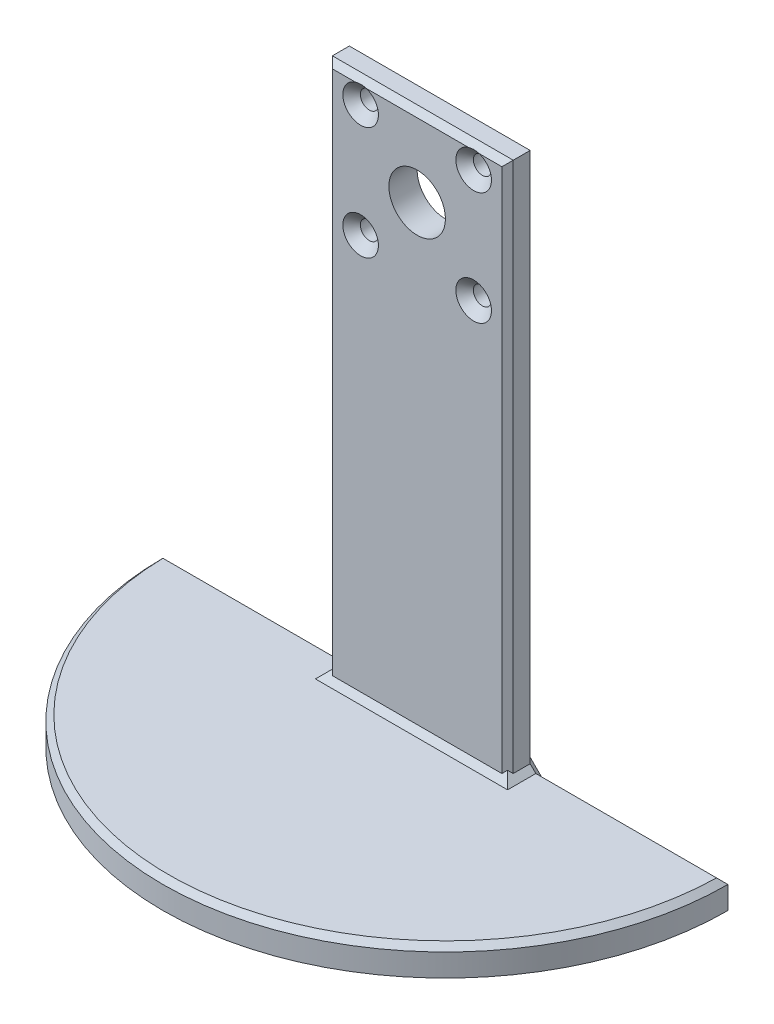
ISO-10303-21;
HEADER;
FILE_DESCRIPTION(('STEP AP214'),'2;1');
FILE_NAME('part.step','',(''),(''),'','','');
FILE_SCHEMA(('AUTOMOTIVE_DESIGN { 1 0 10303 214 1 1 1 1 }'));
ENDSEC;
DATA;
#1=APPLICATION_CONTEXT('core data for automotive mechanical design processes');
#2=APPLICATION_PROTOCOL_DEFINITION('international standard','automotive_design',2000,#1);
#3=PRODUCT_CONTEXT('',#1,'mechanical');
#4=PRODUCT('Part','Part','',(#3));
#5=PRODUCT_RELATED_PRODUCT_CATEGORY('part','',(#4));
#6=PRODUCT_DEFINITION_FORMATION('','',#4);
#7=PRODUCT_DEFINITION_CONTEXT('part definition',#1,'design');
#8=PRODUCT_DEFINITION('design','',#6,#7);
#9=PRODUCT_DEFINITION_SHAPE('','',#8);
#10=(LENGTH_UNIT() NAMED_UNIT(*) SI_UNIT(.MILLI.,.METRE.));
#11=(NAMED_UNIT(*) PLANE_ANGLE_UNIT() SI_UNIT($,.RADIAN.));
#12=(NAMED_UNIT(*) SI_UNIT($,.STERADIAN.) SOLID_ANGLE_UNIT());
#13=UNCERTAINTY_MEASURE_WITH_UNIT(LENGTH_MEASURE(1.E-05),#10,'distance_accuracy_value','');
#14=(GEOMETRIC_REPRESENTATION_CONTEXT(3) GLOBAL_UNCERTAINTY_ASSIGNED_CONTEXT((#13)) GLOBAL_UNIT_ASSIGNED_CONTEXT((#10,
#11,#12)) REPRESENTATION_CONTEXT('',''));
#15=CARTESIAN_POINT('',(0.,0.,0.));
#16=DIRECTION('',(0.,0.,1.));
#17=DIRECTION('',(1.,0.,0.));
#18=AXIS2_PLACEMENT_3D('',#15,#16,#17);
#19=CARTESIAN_POINT('',(-10.,10.,5.));
#20=DIRECTION('',(0.,0.,-1.));
#21=DIRECTION('',(-1.,0.,0.));
#22=AXIS2_PLACEMENT_3D('',#19,#20,#21);
#23=CYLINDRICAL_SURFACE('',#22,1.6);
#24=CARTESIAN_POINT('',(-10.,10.,0.));
#25=DIRECTION('',(0.,0.,1.));
#26=DIRECTION('',(1.,0.,0.));
#27=AXIS2_PLACEMENT_3D('',#24,#25,#26);
#28=CIRCLE('',#27,1.6);
#29=CARTESIAN_POINT('',(-8.4,10.,0.));
#30=VERTEX_POINT('',#29);
#31=EDGE_CURVE('E522',#30,#30,#28,.T.);
#32=ORIENTED_EDGE('',*,*,#31,.F.);
#33=EDGE_LOOP('',(#32));
#34=FACE_BOUND('',#33,.T.);
#35=CARTESIAN_POINT('',(-10.,10.,3.45));
#36=DIRECTION('',(0.,0.,1.));
#37=DIRECTION('',(1.,0.,0.));
#38=AXIS2_PLACEMENT_3D('',#35,#36,#37);
#39=CIRCLE('',#38,1.6);
#40=CARTESIAN_POINT('',(-8.4,10.,3.45));
#41=VERTEX_POINT('',#40);
#42=EDGE_CURVE('E182',#41,#41,#39,.T.);
#43=ORIENTED_EDGE('',*,*,#42,.T.);
#44=EDGE_LOOP('',(#43));
#45=FACE_BOUND('',#44,.T.);
#46=ADVANCED_FACE('F43',(#34,#45),#23,.F.);
#47=CARTESIAN_POINT('',(-10.,-10.,5.));
#48=DIRECTION('',(0.,0.,-1.));
#49=DIRECTION('',(-1.,0.,0.));
#50=AXIS2_PLACEMENT_3D('',#47,#48,#49);
#51=CYLINDRICAL_SURFACE('',#50,1.6);
#52=CARTESIAN_POINT('',(-10.,-10.,0.));
#53=DIRECTION('',(0.,0.,1.));
#54=DIRECTION('',(1.,0.,0.));
#55=AXIS2_PLACEMENT_3D('',#52,#53,#54);
#56=CIRCLE('',#55,1.6);
#57=CARTESIAN_POINT('',(-8.4,-10.,0.));
#58=VERTEX_POINT('',#57);
#59=EDGE_CURVE('E525',#58,#58,#56,.T.);
#60=ORIENTED_EDGE('',*,*,#59,.F.);
#61=EDGE_LOOP('',(#60));
#62=FACE_BOUND('',#61,.T.);
#63=CARTESIAN_POINT('',(-10.,-10.,3.45));
#64=DIRECTION('',(0.,0.,1.));
#65=DIRECTION('',(1.,0.,0.));
#66=AXIS2_PLACEMENT_3D('',#63,#64,#65);
#67=CIRCLE('',#66,1.6);
#68=CARTESIAN_POINT('',(-8.4,-10.,3.45));
#69=VERTEX_POINT('',#68);
#70=EDGE_CURVE('E558',#69,#69,#67,.T.);
#71=ORIENTED_EDGE('',*,*,#70,.T.);
#72=EDGE_LOOP('',(#71));
#73=FACE_BOUND('',#72,.T.);
#74=ADVANCED_FACE('F268',(#62,#73),#51,.F.);
#75=CARTESIAN_POINT('',(0.,0.,0.));
#76=DIRECTION('',(0.,0.,-1.));
#77=DIRECTION('',(-1.,0.,0.));
#78=AXIS2_PLACEMENT_3D('',#75,#76,#77);
#79=PLANE('',#78);
#80=CARTESIAN_POINT('',(10.,10.,0.));
#81=DIRECTION('',(0.,0.,1.));
#82=DIRECTION('',(1.,0.,0.));
#83=AXIS2_PLACEMENT_3D('',#80,#81,#82);
#84=CIRCLE('',#83,1.6);
#85=CARTESIAN_POINT('',(11.6,10.,0.));
#86=VERTEX_POINT('',#85);
#87=EDGE_CURVE('E517',#86,#86,#84,.T.);
#88=ORIENTED_EDGE('',*,*,#87,.T.);
#89=EDGE_LOOP('',(#88));
#90=FACE_BOUND('',#89,.T.);
#91=ORIENTED_EDGE('',*,*,#59,.T.);
#92=EDGE_LOOP('',(#91));
#93=FACE_BOUND('',#92,.T.);
#94=CARTESIAN_POINT('',(0.,0.,0.));
#95=DIRECTION('',(0.,0.,1.));
#96=DIRECTION('',(1.,0.,0.));
#97=AXIS2_PLACEMENT_3D('',#94,#95,#96);
#98=CIRCLE('',#97,5.);
#99=CARTESIAN_POINT('',(5.,0.,0.));
#100=VERTEX_POINT('',#99);
#101=EDGE_CURVE('E531',#100,#100,#98,.T.);
#102=ORIENTED_EDGE('',*,*,#101,.T.);
#103=EDGE_LOOP('',(#102));
#104=FACE_BOUND('',#103,.T.);
#105=CARTESIAN_POINT('',(10.,-10.,0.));
#106=DIRECTION('',(0.,0.,1.));
#107=DIRECTION('',(1.,0.,0.));
#108=AXIS2_PLACEMENT_3D('',#105,#106,#107);
#109=CIRCLE('',#108,1.6);
#110=CARTESIAN_POINT('',(11.6,-10.,0.));
#111=VERTEX_POINT('',#110);
#112=EDGE_CURVE('E528',#111,#111,#109,.T.);
#113=ORIENTED_EDGE('',*,*,#112,.T.);
#114=EDGE_LOOP('',(#113));
#115=FACE_BOUND('',#114,.T.);
#116=ORIENTED_EDGE('',*,*,#31,.T.);
#117=EDGE_LOOP('',(#116));
#118=FACE_BOUND('',#117,.T.);
#119=DIRECTION('',(0.,1.,0.));
#120=VECTOR('',#119,1.);
#121=CARTESIAN_POINT('',(-15.,14.,0.));
#122=LINE('',#121,#120);
#123=CARTESIAN_POINT('',(-15.,-80.,0.));
#124=VERTEX_POINT('',#123);
#125=CARTESIAN_POINT('',(-15.,13.,0.));
#126=VERTEX_POINT('',#125);
#127=EDGE_CURVE('E416',#124,#126,#122,.T.);
#128=ORIENTED_EDGE('',*,*,#127,.T.);
#129=DIRECTION('',(1.,0.,0.));
#130=VECTOR('',#129,1.);
#131=CARTESIAN_POINT('',(15.,13.,0.));
#132=LINE('',#131,#130);
#133=CARTESIAN_POINT('',(15.,13.,0.));
#134=VERTEX_POINT('',#133);
#135=EDGE_CURVE('E228',#126,#134,#132,.T.);
#136=ORIENTED_EDGE('',*,*,#135,.T.);
#137=DIRECTION('',(0.,-1.,0.));
#138=VECTOR('',#137,1.);
#139=CARTESIAN_POINT('',(15.,-81.,0.));
#140=LINE('',#139,#138);
#141=CARTESIAN_POINT('',(15.,-80.,0.));
#142=VERTEX_POINT('',#141);
#143=EDGE_CURVE('E474',#134,#142,#140,.T.);
#144=ORIENTED_EDGE('',*,*,#143,.T.);
#145=DIRECTION('',(-0.707106781186548,0.707106781186548,0.));
#146=VECTOR('',#145,1.);
#147=CARTESIAN_POINT('',(-32.5,-32.5,0.));
#148=LINE('',#147,#146);
#149=CARTESIAN_POINT('',(16.,-81.,0.));
#150=VERTEX_POINT('',#149);
#151=EDGE_CURVE('E471',#150,#142,#148,.T.);
#152=ORIENTED_EDGE('',*,*,#151,.F.);
#153=DIRECTION('',(-0.707106781186548,0.707106781186548,0.));
#154=VECTOR('',#153,1.);
#155=CARTESIAN_POINT('',(-32.5,-32.5,0.));
#156=LINE('',#155,#154);
#157=CARTESIAN_POINT('',(17.0000000000001,-82.,0.));
#158=VERTEX_POINT('',#157);
#159=EDGE_CURVE('E465',#158,#150,#156,.T.);
#160=ORIENTED_EDGE('',*,*,#159,.F.);
#161=DIRECTION('',(1.,0.,0.));
#162=VECTOR('',#161,1.);
#163=CARTESIAN_POINT('',(50.,-82.,0.));
#164=LINE('',#163,#162);
#165=CARTESIAN_POINT('',(50.,-82.,0.));
#166=VERTEX_POINT('',#165);
#167=EDGE_CURVE('E463',#158,#166,#164,.T.);
#168=ORIENTED_EDGE('',*,*,#167,.T.);
#169=DIRECTION('',(0.,-1.,0.));
#170=VECTOR('',#169,1.);
#171=CARTESIAN_POINT('',(50.,-81.,0.));
#172=LINE('',#171,#170);
#173=CARTESIAN_POINT('',(50.,-86.,0.));
#174=VERTEX_POINT('',#173);
#175=EDGE_CURVE('E500',#166,#174,#172,.T.);
#176=ORIENTED_EDGE('',*,*,#175,.T.);
#177=DIRECTION('',(1.,0.,0.));
#178=VECTOR('',#177,1.);
#179=CARTESIAN_POINT('',(16.,-86.,0.));
#180=LINE('',#179,#178);
#181=CARTESIAN_POINT('',(-50.,-86.,0.));
#182=VERTEX_POINT('',#181);
#183=EDGE_CURVE('E535',#182,#174,#180,.T.);
#184=ORIENTED_EDGE('',*,*,#183,.F.);
#185=DIRECTION('',(0.,-1.,0.));
#186=VECTOR('',#185,1.);
#187=CARTESIAN_POINT('',(-50.,-81.,0.));
#188=LINE('',#187,#186);
#189=CARTESIAN_POINT('',(-50.,-82.,0.));
#190=VERTEX_POINT('',#189);
#191=EDGE_CURVE('E483',#190,#182,#188,.T.);
#192=ORIENTED_EDGE('',*,*,#191,.F.);
#193=DIRECTION('',(1.,0.,0.));
#194=VECTOR('',#193,1.);
#195=CARTESIAN_POINT('',(-16.,-82.,0.));
#196=LINE('',#195,#194);
#197=CARTESIAN_POINT('',(-17.,-82.,0.));
#198=VERTEX_POINT('',#197);
#199=EDGE_CURVE('E421',#190,#198,#196,.T.);
#200=ORIENTED_EDGE('',*,*,#199,.T.);
#201=DIRECTION('',(-0.707106781186548,-0.707106781186548,0.));
#202=VECTOR('',#201,1.);
#203=CARTESIAN_POINT('',(32.5,-32.5,0.));
#204=LINE('',#203,#202);
#205=CARTESIAN_POINT('',(-16.,-81.,0.));
#206=VERTEX_POINT('',#205);
#207=EDGE_CURVE('E476',#206,#198,#204,.T.);
#208=ORIENTED_EDGE('',*,*,#207,.F.);
#209=DIRECTION('',(-0.707106781186548,-0.707106781186548,0.));
#210=VECTOR('',#209,1.);
#211=CARTESIAN_POINT('',(32.5,-32.5,0.));
#212=LINE('',#211,#210);
#213=EDGE_CURVE('E478',#124,#206,#212,.T.);
#214=ORIENTED_EDGE('',*,*,#213,.F.);
#215=EDGE_LOOP('',(#128,#136,#144,#152,#160,#168,#176,#184,#192,#200,#208,#214));
#216=FACE_BOUND('',#215,.T.);
#217=ADVANCED_FACE('F272',(#90,#93,#104,#115,#118,#216),#79,.T.);
#218=CARTESIAN_POINT('',(0.,0.,5.));
#219=DIRECTION('',(0.,0.,-1.));
#220=DIRECTION('',(-1.,0.,0.));
#221=AXIS2_PLACEMENT_3D('',#218,#219,#220);
#222=PLANE('',#221);
#223=CARTESIAN_POINT('',(-10.,-10.,5.));
#224=DIRECTION('',(0.,0.,1.));
#225=DIRECTION('',(1.,0.,0.));
#226=AXIS2_PLACEMENT_3D('',#223,#224,#225);
#227=CIRCLE('',#226,3.15);
#228=CARTESIAN_POINT('',(-6.85,-10.,5.));
#229=VERTEX_POINT('',#228);
#230=EDGE_CURVE('E555',#229,#229,#227,.T.);
#231=ORIENTED_EDGE('',*,*,#230,.F.);
#232=EDGE_LOOP('',(#231));
#233=FACE_BOUND('',#232,.T.);
#234=CARTESIAN_POINT('',(10.,-10.,5.));
#235=DIRECTION('',(0.,0.,1.));
#236=DIRECTION('',(1.,0.,0.));
#237=AXIS2_PLACEMENT_3D('',#234,#235,#236);
#238=CIRCLE('',#237,3.15);
#239=CARTESIAN_POINT('',(13.15,-10.,5.));
#240=VERTEX_POINT('',#239);
#241=EDGE_CURVE('E561',#240,#240,#238,.T.);
#242=ORIENTED_EDGE('',*,*,#241,.F.);
#243=EDGE_LOOP('',(#242));
#244=FACE_BOUND('',#243,.T.);
#245=CARTESIAN_POINT('',(0.,0.,5.));
#246=DIRECTION('',(0.,0.,1.));
#247=DIRECTION('',(1.,0.,0.));
#248=AXIS2_PLACEMENT_3D('',#245,#246,#247);
#249=CIRCLE('',#248,5.);
#250=CARTESIAN_POINT('',(5.,0.,5.));
#251=VERTEX_POINT('',#250);
#252=EDGE_CURVE('E532',#251,#251,#249,.T.);
#253=ORIENTED_EDGE('',*,*,#252,.F.);
#254=EDGE_LOOP('',(#253));
#255=FACE_BOUND('',#254,.T.);
#256=DIRECTION('',(-1.,0.,0.));
#257=VECTOR('',#256,1.);
#258=CARTESIAN_POINT('',(0.,13.,5.));
#259=LINE('',#258,#257);
#260=CARTESIAN_POINT('',(9.03953136438512,13.,5.));
#261=VERTEX_POINT('',#260);
#262=CARTESIAN_POINT('',(-9.03953136438511,13.,5.));
#263=VERTEX_POINT('',#262);
#264=EDGE_CURVE('E181',#261,#263,#259,.T.);
#265=ORIENTED_EDGE('',*,*,#264,.T.);
#266=CARTESIAN_POINT('',(-10.,10.,5.));
#267=DIRECTION('',(0.,0.,1.));
#268=DIRECTION('',(1.,0.,0.));
#269=AXIS2_PLACEMENT_3D('',#266,#267,#268);
#270=CIRCLE('',#269,3.15);
#271=CARTESIAN_POINT('',(-10.9604686356149,13.,5.));
#272=VERTEX_POINT('',#271);
#273=EDGE_CURVE('E63',#272,#263,#270,.T.);
#274=ORIENTED_EDGE('',*,*,#273,.F.);
#275=CARTESIAN_POINT('',(-15.,13.,5.));
#276=VERTEX_POINT('',#275);
#277=EDGE_CURVE('E179',#272,#276,#259,.T.);
#278=ORIENTED_EDGE('',*,*,#277,.T.);
#279=DIRECTION('',(0.,-1.,0.));
#280=VECTOR('',#279,1.);
#281=CARTESIAN_POINT('',(-15.,0.,5.));
#282=LINE('',#281,#280);
#283=CARTESIAN_POINT('',(-15.,-80.,5.));
#284=VERTEX_POINT('',#283);
#285=EDGE_CURVE('E189',#276,#284,#282,.T.);
#286=ORIENTED_EDGE('',*,*,#285,.T.);
#287=DIRECTION('',(1.,0.,0.));
#288=VECTOR('',#287,1.);
#289=CARTESIAN_POINT('',(16.,-80.,5.));
#290=LINE('',#289,#288);
#291=CARTESIAN_POINT('',(15.0000000000001,-80.,5.));
#292=VERTEX_POINT('',#291);
#293=EDGE_CURVE('E192',#284,#292,#290,.T.);
#294=ORIENTED_EDGE('',*,*,#293,.T.);
#295=DIRECTION('',(0.,1.,0.));
#296=VECTOR('',#295,1.);
#297=CARTESIAN_POINT('',(15.,0.,5.));
#298=LINE('',#297,#296);
#299=CARTESIAN_POINT('',(15.,13.,5.));
#300=VERTEX_POINT('',#299);
#301=EDGE_CURVE('E196',#292,#300,#298,.T.);
#302=ORIENTED_EDGE('',*,*,#301,.T.);
#303=CARTESIAN_POINT('',(10.9604686356149,13.,5.));
#304=VERTEX_POINT('',#303);
#305=EDGE_CURVE('E191',#300,#304,#259,.T.);
#306=ORIENTED_EDGE('',*,*,#305,.T.);
#307=CARTESIAN_POINT('',(10.,10.,5.));
#308=DIRECTION('',(0.,0.,1.));
#309=DIRECTION('',(1.,0.,0.));
#310=AXIS2_PLACEMENT_3D('',#307,#308,#309);
#311=CIRCLE('',#310,3.15);
#312=EDGE_CURVE('E70',#261,#304,#311,.T.);
#313=ORIENTED_EDGE('',*,*,#312,.F.);
#314=EDGE_LOOP('',(#265,#274,#278,#286,#294,#302,#306,#313));
#315=FACE_BOUND('',#314,.T.);
#316=ADVANCED_FACE('F178',(#233,#244,#255,#315),#222,.F.);
#317=CARTESIAN_POINT('',(16.,7.59711279590122,5.));
#318=DIRECTION('',(-1.,0.,0.));
#319=DIRECTION('',(0.,-1.,0.));
#320=AXIS2_PLACEMENT_3D('',#317,#318,#319);
#321=PLANE('',#320);
#322=DIRECTION('',(0.,0.,-1.));
#323=VECTOR('',#322,1.);
#324=CARTESIAN_POINT('',(16.,14.,5.));
#325=LINE('',#324,#323);
#326=CARTESIAN_POINT('',(16.,14.,4.));
#327=VERTEX_POINT('',#326);
#328=CARTESIAN_POINT('',(16.,14.,1.00000000000001));
#329=VERTEX_POINT('',#328);
#330=EDGE_CURVE('E457',#327,#329,#325,.T.);
#331=ORIENTED_EDGE('',*,*,#330,.F.);
#332=DIRECTION('',(0.,-1.,0.));
#333=VECTOR('',#332,1.);
#334=CARTESIAN_POINT('',(16.,7.59711279590122,4.));
#335=LINE('',#334,#333);
#336=CARTESIAN_POINT('',(16.0000000000001,-80.,4.));
#337=VERTEX_POINT('',#336);
#338=EDGE_CURVE('E199',#327,#337,#335,.T.);
#339=ORIENTED_EDGE('',*,*,#338,.T.);
#340=DIRECTION('',(0.,0.,-1.));
#341=VECTOR('',#340,1.);
#342=CARTESIAN_POINT('',(16.0000000000001,-80.,0.));
#343=LINE('',#342,#341);
#344=CARTESIAN_POINT('',(16.0000000000001,-80.,1.00000000000001));
#345=VERTEX_POINT('',#344);
#346=EDGE_CURVE('E410',#337,#345,#343,.T.);
#347=ORIENTED_EDGE('',*,*,#346,.T.);
#348=DIRECTION('',(0.,1.,0.));
#349=VECTOR('',#348,1.);
#350=CARTESIAN_POINT('',(16.,14.,1.00000000000001));
#351=LINE('',#350,#349);
#352=EDGE_CURVE('E415',#345,#329,#351,.T.);
#353=ORIENTED_EDGE('',*,*,#352,.T.);
#354=EDGE_LOOP('',(#331,#339,#347,#353));
#355=FACE_BOUND('',#354,.T.);
#356=ADVANCED_FACE('F284',(#355),#321,.F.);
#357=CARTESIAN_POINT('',(-16.,-16.4242754655761,5.));
#358=DIRECTION('',(1.,0.,0.));
#359=DIRECTION('',(0.,1.,0.));
#360=AXIS2_PLACEMENT_3D('',#357,#358,#359);
#361=PLANE('',#360);
#362=DIRECTION('',(0.,0.,1.));
#363=VECTOR('',#362,1.);
#364=CARTESIAN_POINT('',(-16.,-80.,5.));
#365=LINE('',#364,#363);
#366=CARTESIAN_POINT('',(-16.,-80.,1.00000000000001));
#367=VERTEX_POINT('',#366);
#368=CARTESIAN_POINT('',(-16.,-80.,4.));
#369=VERTEX_POINT('',#368);
#370=EDGE_CURVE('E452',#367,#369,#365,.T.);
#371=ORIENTED_EDGE('',*,*,#370,.T.);
#372=DIRECTION('',(0.,1.,0.));
#373=VECTOR('',#372,1.);
#374=CARTESIAN_POINT('',(-16.,-16.4242754655761,4.));
#375=LINE('',#374,#373);
#376=CARTESIAN_POINT('',(-16.,14.,4.));
#377=VERTEX_POINT('',#376);
#378=EDGE_CURVE('E206',#369,#377,#375,.T.);
#379=ORIENTED_EDGE('',*,*,#378,.T.);
#380=DIRECTION('',(0.,0.,-1.));
#381=VECTOR('',#380,1.);
#382=CARTESIAN_POINT('',(-16.,14.,5.));
#383=LINE('',#382,#381);
#384=CARTESIAN_POINT('',(-16.,14.,1.00000000000001));
#385=VERTEX_POINT('',#384);
#386=EDGE_CURVE('E462',#377,#385,#383,.T.);
#387=ORIENTED_EDGE('',*,*,#386,.T.);
#388=DIRECTION('',(0.,-1.,0.));
#389=VECTOR('',#388,1.);
#390=CARTESIAN_POINT('',(-16.,-81.,1.00000000000001));
#391=LINE('',#390,#389);
#392=EDGE_CURVE('E456',#385,#367,#391,.T.);
#393=ORIENTED_EDGE('',*,*,#392,.T.);
#394=EDGE_LOOP('',(#371,#379,#387,#393));
#395=FACE_BOUND('',#394,.T.);
#396=ADVANCED_FACE('F293',(#395),#361,.F.);
#397=CARTESIAN_POINT('',(16.,14.,5.));
#398=DIRECTION('',(0.,-1.,0.));
#399=DIRECTION('',(1.,0.,0.));
#400=AXIS2_PLACEMENT_3D('',#397,#398,#399);
#401=PLANE('',#400);
#402=ORIENTED_EDGE('',*,*,#330,.T.);
#403=DIRECTION('',(-1.,0.,0.));
#404=VECTOR('',#403,1.);
#405=CARTESIAN_POINT('',(-15.,14.,0.999999999999987));
#406=LINE('',#405,#404);
#407=EDGE_CURVE('E218',#329,#385,#406,.T.);
#408=ORIENTED_EDGE('',*,*,#407,.T.);
#409=ORIENTED_EDGE('',*,*,#386,.F.);
#410=DIRECTION('',(1.,0.,0.));
#411=VECTOR('',#410,1.);
#412=CARTESIAN_POINT('',(16.,14.,4.));
#413=LINE('',#412,#411);
#414=EDGE_CURVE('E202',#377,#327,#413,.T.);
#415=ORIENTED_EDGE('',*,*,#414,.T.);
#416=EDGE_LOOP('',(#402,#408,#409,#415));
#417=FACE_BOUND('',#416,.T.);
#418=ADVANCED_FACE('F291',(#417),#401,.F.);
#419=CARTESIAN_POINT('',(16.,-86.,5.));
#420=DIRECTION('',(0.,1.,0.));
#421=DIRECTION('',(0.,0.,1.));
#422=AXIS2_PLACEMENT_3D('',#419,#420,#421);
#423=PLANE('',#422);
#424=ORIENTED_EDGE('',*,*,#183,.T.);
#425=CARTESIAN_POINT('',(0.,-86.,0.));
#426=DIRECTION('',(0.,-1.,0.));
#427=DIRECTION('',(0.,0.,-1.));
#428=AXIS2_PLACEMENT_3D('',#425,#426,#427);
#429=CIRCLE('',#428,50.);
#430=EDGE_CURVE('E497',#174,#182,#429,.T.);
#431=ORIENTED_EDGE('',*,*,#430,.T.);
#432=EDGE_LOOP('',(#424,#431));
#433=FACE_BOUND('',#432,.T.);
#434=ADVANCED_FACE('F280',(#433),#423,.F.);
#435=CARTESIAN_POINT('',(0.,0.,5.));
#436=DIRECTION('',(0.,0.,-1.));
#437=DIRECTION('',(-1.,0.,0.));
#438=AXIS2_PLACEMENT_3D('',#435,#436,#437);
#439=CYLINDRICAL_SURFACE('',#438,5.);
#440=ORIENTED_EDGE('',*,*,#252,.T.);
#441=EDGE_LOOP('',(#440));
#442=FACE_BOUND('',#441,.T.);
#443=ORIENTED_EDGE('',*,*,#101,.F.);
#444=EDGE_LOOP('',(#443));
#445=FACE_BOUND('',#444,.T.);
#446=ADVANCED_FACE('F276',(#442,#445),#439,.F.);
#447=CARTESIAN_POINT('',(10.,-10.,5.));
#448=DIRECTION('',(0.,0.,-1.));
#449=DIRECTION('',(-1.,0.,0.));
#450=AXIS2_PLACEMENT_3D('',#447,#448,#449);
#451=CYLINDRICAL_SURFACE('',#450,1.6);
#452=CARTESIAN_POINT('',(10.,-10.,3.45));
#453=DIRECTION('',(0.,0.,1.));
#454=DIRECTION('',(1.,0.,0.));
#455=AXIS2_PLACEMENT_3D('',#452,#453,#454);
#456=CIRCLE('',#455,1.6);
#457=CARTESIAN_POINT('',(11.6,-10.,3.45));
#458=VERTEX_POINT('',#457);
#459=EDGE_CURVE('E221',#458,#458,#456,.T.);
#460=ORIENTED_EDGE('',*,*,#459,.T.);
#461=EDGE_LOOP('',(#460));
#462=FACE_BOUND('',#461,.T.);
#463=ORIENTED_EDGE('',*,*,#112,.F.);
#464=EDGE_LOOP('',(#463));
#465=FACE_BOUND('',#464,.T.);
#466=ADVANCED_FACE('F264',(#462,#465),#451,.F.);
#467=CARTESIAN_POINT('',(10.,10.,5.));
#468=DIRECTION('',(0.,0.,-1.));
#469=DIRECTION('',(-1.,0.,0.));
#470=AXIS2_PLACEMENT_3D('',#467,#468,#469);
#471=CYLINDRICAL_SURFACE('',#470,1.6);
#472=CARTESIAN_POINT('',(10.,10.,3.45));
#473=DIRECTION('',(0.,0.,1.));
#474=DIRECTION('',(1.,0.,0.));
#475=AXIS2_PLACEMENT_3D('',#472,#473,#474);
#476=CIRCLE('',#475,1.6);
#477=CARTESIAN_POINT('',(11.6,10.,3.45));
#478=VERTEX_POINT('',#477);
#479=EDGE_CURVE('E550',#478,#478,#476,.T.);
#480=ORIENTED_EDGE('',*,*,#479,.T.);
#481=EDGE_LOOP('',(#480));
#482=FACE_BOUND('',#481,.T.);
#483=ORIENTED_EDGE('',*,*,#87,.F.);
#484=EDGE_LOOP('',(#483));
#485=FACE_BOUND('',#484,.T.);
#486=ADVANCED_FACE('F260',(#482,#485),#471,.F.);
#487=CARTESIAN_POINT('',(0.,-81.,0.));
#488=DIRECTION('',(0.,-1.,0.));
#489=DIRECTION('',(0.,0.,-1.));
#490=AXIS2_PLACEMENT_3D('',#487,#488,#489);
#491=CYLINDRICAL_SURFACE('',#490,50.);
#492=ORIENTED_EDGE('',*,*,#175,.F.);
#493=CARTESIAN_POINT('',(0.,-82.,0.));
#494=DIRECTION('',(0.,-1.,0.));
#495=DIRECTION('',(0.,0.,-1.));
#496=AXIS2_PLACEMENT_3D('',#493,#494,#495);
#497=CIRCLE('',#496,50.);
#498=EDGE_CURVE('E418',#166,#190,#497,.T.);
#499=ORIENTED_EDGE('',*,*,#498,.T.);
#500=ORIENTED_EDGE('',*,*,#191,.T.);
#501=ORIENTED_EDGE('',*,*,#430,.F.);
#502=EDGE_LOOP('',(#492,#499,#500,#501));
#503=FACE_BOUND('',#502,.T.);
#504=ADVANCED_FACE('F256',(#503),#491,.T.);
#505=CARTESIAN_POINT('',(0.,-81.,0.));
#506=DIRECTION('',(0.,-1.,0.));
#507=DIRECTION('',(0.,0.,-1.));
#508=AXIS2_PLACEMENT_3D('',#505,#506,#507);
#509=PLANE('',#508);
#510=DIRECTION('',(-1.,0.,0.));
#511=VECTOR('',#510,1.);
#512=CARTESIAN_POINT('',(-50.,-81.,1.00000000000001));
#513=LINE('',#512,#511);
#514=CARTESIAN_POINT('',(-17.,-81.,1.00000000000001));
#515=VERTEX_POINT('',#514);
#516=CARTESIAN_POINT('',(-48.9897948556635,-81.,1.00000000000001));
#517=VERTEX_POINT('',#516);
#518=EDGE_CURVE('E434',#515,#517,#513,.T.);
#519=ORIENTED_EDGE('',*,*,#518,.T.);
#520=CARTESIAN_POINT('',(0.,-81.,0.));
#521=DIRECTION('',(0.,-1.,0.));
#522=DIRECTION('',(0.,0.,-1.));
#523=AXIS2_PLACEMENT_3D('',#520,#521,#522);
#524=CIRCLE('',#523,49.);
#525=CARTESIAN_POINT('',(48.9897948556635,-81.,1.00000000000001));
#526=VERTEX_POINT('',#525);
#527=EDGE_CURVE('E436',#517,#526,#524,.F.);
#528=ORIENTED_EDGE('',*,*,#527,.T.);
#529=DIRECTION('',(-1.,0.,0.));
#530=VECTOR('',#529,1.);
#531=CARTESIAN_POINT('',(16.,-81.,1.00000000000001));
#532=LINE('',#531,#530);
#533=CARTESIAN_POINT('',(17.0000000000001,-81.,1.00000000000001));
#534=VERTEX_POINT('',#533);
#535=EDGE_CURVE('E426',#526,#534,#532,.T.);
#536=ORIENTED_EDGE('',*,*,#535,.T.);
#537=DIRECTION('',(0.,0.,1.));
#538=VECTOR('',#537,1.);
#539=CARTESIAN_POINT('',(17.0000000000001,-81.,5.));
#540=LINE('',#539,#538);
#541=CARTESIAN_POINT('',(17.0000000000001,-81.,6.00000000000002));
#542=VERTEX_POINT('',#541);
#543=EDGE_CURVE('E428',#534,#542,#540,.T.);
#544=ORIENTED_EDGE('',*,*,#543,.T.);
#545=DIRECTION('',(-1.,0.,0.));
#546=VECTOR('',#545,1.);
#547=CARTESIAN_POINT('',(-16.,-81.,6.00000000000002));
#548=LINE('',#547,#546);
#549=CARTESIAN_POINT('',(-17.,-81.,6.00000000000002));
#550=VERTEX_POINT('',#549);
#551=EDGE_CURVE('E430',#542,#550,#548,.T.);
#552=ORIENTED_EDGE('',*,*,#551,.T.);
#553=DIRECTION('',(0.,0.,-1.));
#554=VECTOR('',#553,1.);
#555=CARTESIAN_POINT('',(-17.,-81.,0.));
#556=LINE('',#555,#554);
#557=EDGE_CURVE('E432',#550,#515,#556,.T.);
#558=ORIENTED_EDGE('',*,*,#557,.T.);
#559=EDGE_LOOP('',(#519,#528,#536,#544,#552,#558));
#560=FACE_BOUND('',#559,.T.);
#561=ADVANCED_FACE('F252',(#560),#509,.F.);
#562=CARTESIAN_POINT('',(16.,7.59711279590122,1.00000000000001));
#563=DIRECTION('',(0.707106781186547,0.,-0.707106781186548));
#564=DIRECTION('',(0.,-1.,0.));
#565=AXIS2_PLACEMENT_3D('',#562,#563,#564);
#566=PLANE('',#565);
#567=ORIENTED_EDGE('',*,*,#143,.F.);
#568=DIRECTION('',(0.577350269189623,0.577350269189632,0.577350269189623));
#569=VECTOR('',#568,1.);
#570=CARTESIAN_POINT('',(13.8657042653004,11.8657042653004,-1.1342957346996));
#571=LINE('',#570,#569);
#572=EDGE_CURVE('E230',#134,#329,#571,.T.);
#573=ORIENTED_EDGE('',*,*,#572,.T.);
#574=ORIENTED_EDGE('',*,*,#352,.F.);
#575=DIRECTION('',(0.707106781186548,0.,0.707106781186547));
#576=VECTOR('',#575,1.);
#577=CARTESIAN_POINT('',(15.,-80.,0.));
#578=LINE('',#577,#576);
#579=EDGE_CURVE('E495',#142,#345,#578,.T.);
#580=ORIENTED_EDGE('',*,*,#579,.F.);
#581=EDGE_LOOP('',(#567,#573,#574,#580));
#582=FACE_BOUND('',#581,.T.);
#583=ADVANCED_FACE('F255',(#582),#566,.T.);
#584=CARTESIAN_POINT('',(16.0000000000001,-80.,1.00000000000001));
#585=DIRECTION('',(0.577350269189625,0.577350269189625,-0.577350269189626));
#586=DIRECTION('',(-0.707106781186548,0.,-0.707106781186547));
#587=AXIS2_PLACEMENT_3D('',#584,#585,#586);
#588=PLANE('',#587);
#589=ORIENTED_EDGE('',*,*,#151,.T.);
#590=ORIENTED_EDGE('',*,*,#579,.T.);
#591=DIRECTION('',(-0.707106781186548,0.707106781186548,0.));
#592=VECTOR('',#591,1.);
#593=CARTESIAN_POINT('',(17.0000000000001,-81.,1.00000000000001));
#594=LINE('',#593,#592);
#595=EDGE_CURVE('E412',#534,#345,#594,.T.);
#596=ORIENTED_EDGE('',*,*,#595,.F.);
#597=DIRECTION('',(0.,-0.707106781186547,-0.707106781186547));
#598=VECTOR('',#597,1.);
#599=CARTESIAN_POINT('',(17.0000000000001,-81.,1.00000000000001));
#600=LINE('',#599,#598);
#601=EDGE_CURVE('E502',#158,#534,#600,.F.);
#602=ORIENTED_EDGE('',*,*,#601,.F.);
#603=ORIENTED_EDGE('',*,*,#159,.T.);
#604=EDGE_LOOP('',(#589,#590,#596,#602,#603));
#605=FACE_BOUND('',#604,.T.);
#606=ADVANCED_FACE('F377',(#605),#588,.T.);
#607=CARTESIAN_POINT('',(17.0000000000001,-81.,0.));
#608=DIRECTION('',(0.707106781186547,0.707106781186547,0.));
#609=DIRECTION('',(0.,0.,-1.));
#610=AXIS2_PLACEMENT_3D('',#607,#608,#609);
#611=PLANE('',#610);
#612=ORIENTED_EDGE('',*,*,#595,.T.);
#613=ORIENTED_EDGE('',*,*,#346,.F.);
#614=DIRECTION('',(-0.577350269189623,0.577350269189623,0.577350269189631));
#615=VECTOR('',#614,1.);
#616=CARTESIAN_POINT('',(18.0000000000001,-82.,1.99999999999996));
#617=LINE('',#616,#615);
#618=CARTESIAN_POINT('',(15.5000000000001,-79.5,4.5));
#619=VERTEX_POINT('',#618);
#620=EDGE_CURVE('E208',#337,#619,#617,.T.);
#621=ORIENTED_EDGE('',*,*,#620,.T.);
#622=DIRECTION('',(0.577350269189626,-0.577350269189626,0.577350269189626));
#623=VECTOR('',#622,1.);
#624=CARTESIAN_POINT('',(15.0000000000001,-79.,4.00000000000001));
#625=LINE('',#624,#623);
#626=EDGE_CURVE('E352',#542,#619,#625,.F.);
#627=ORIENTED_EDGE('',*,*,#626,.F.);
#628=ORIENTED_EDGE('',*,*,#543,.F.);
#629=EDGE_LOOP('',(#612,#613,#621,#627,#628));
#630=FACE_BOUND('',#629,.T.);
#631=ADVANCED_FACE('F364',(#630),#611,.T.);
#632=CARTESIAN_POINT('',(0.,-82.,0.));
#633=DIRECTION('',(0.,0.707106781186547,-0.707106781186547));
#634=DIRECTION('',(-1.,0.,0.));
#635=AXIS2_PLACEMENT_3D('',#632,#633,#634);
#636=PLANE('',#635);
#637=ORIENTED_EDGE('',*,*,#601,.T.);
#638=ORIENTED_EDGE('',*,*,#535,.F.);
#639=CARTESIAN_POINT('',(48.9897948556635,-81.,1.00000000000001));
#640=CARTESIAN_POINT('',(49.1593000735599,-81.1660920293913,0.833907970608691));
#641=CARTESIAN_POINT('',(49.3282364494557,-81.3324713823402,0.6675286176598));
#642=CARTESIAN_POINT('',(49.664971497434,-81.6658047157412,0.334195284258842));
#643=CARTESIAN_POINT('',(49.8327701696503,-81.8327586961256,0.167241303874394));
#644=CARTESIAN_POINT('',(50.,-82.,0.));
#645=B_SPLINE_CURVE_WITH_KNOTS('',3,(#639,#640,#641,#642,#643,#644),.UNSPECIFIED.,.F.,.F.,(4,2,
4),(0.,0.868983944319827,1.73796778638479),.UNSPECIFIED.);
#646=EDGE_CURVE('E345',#166,#526,#645,.F.);
#647=ORIENTED_EDGE('',*,*,#646,.F.);
#648=ORIENTED_EDGE('',*,*,#167,.F.);
#649=EDGE_LOOP('',(#637,#638,#647,#648));
#650=FACE_BOUND('',#649,.T.);
#651=ADVANCED_FACE('F355',(#650),#636,.T.);
#652=CARTESIAN_POINT('',(0.,-81.,6.00000000000002));
#653=DIRECTION('',(0.,0.707106781186547,0.707106781186547));
#654=DIRECTION('',(1.,0.,0.));
#655=AXIS2_PLACEMENT_3D('',#652,#653,#654);
#656=PLANE('',#655);
#657=ORIENTED_EDGE('',*,*,#626,.T.);
#658=DIRECTION('',(-0.577350269189621,-0.577350269189628,0.577350269189628));
#659=VECTOR('',#658,1.);
#660=CARTESIAN_POINT('',(9.33333333333346,-85.6666666666667,10.6666666666667));
#661=LINE('',#660,#659);
#662=EDGE_CURVE('E211',#619,#292,#661,.T.);
#663=ORIENTED_EDGE('',*,*,#662,.T.);
#664=ORIENTED_EDGE('',*,*,#293,.F.);
#665=DIRECTION('',(-0.577350269189621,0.577350269189628,-0.577350269189628));
#666=VECTOR('',#665,1.);
#667=CARTESIAN_POINT('',(-9.33333333333342,-85.6666666666666,10.6666666666667));
#668=LINE('',#667,#666);
#669=CARTESIAN_POINT('',(-15.5,-79.5,4.5));
#670=VERTEX_POINT('',#669);
#671=EDGE_CURVE('E213',#284,#670,#668,.T.);
#672=ORIENTED_EDGE('',*,*,#671,.T.);
#673=DIRECTION('',(-0.577350269189626,-0.577350269189626,0.577350269189626));
#674=VECTOR('',#673,1.);
#675=CARTESIAN_POINT('',(-11.3333333333333,-75.3333333333333,0.333333333333346));
#676=LINE('',#675,#674);
#677=EDGE_CURVE('E341',#550,#670,#676,.F.);
#678=ORIENTED_EDGE('',*,*,#677,.F.);
#679=ORIENTED_EDGE('',*,*,#551,.F.);
#680=EDGE_LOOP('',(#657,#663,#664,#672,#678,#679));
#681=FACE_BOUND('',#680,.T.);
#682=ADVANCED_FACE('F363',(#681),#656,.T.);
#683=CARTESIAN_POINT('',(0.,-82.,0.));
#684=DIRECTION('',(0.,-1.,0.));
#685=DIRECTION('',(0.,0.,-1.));
#686=AXIS2_PLACEMENT_3D('',#683,#684,#685);
#687=CONICAL_SURFACE('',#686,50.,0.785398163397448);
#688=ORIENTED_EDGE('',*,*,#646,.T.);
#689=ORIENTED_EDGE('',*,*,#527,.F.);
#690=CARTESIAN_POINT('',(-50.,-82.,0.));
#691=CARTESIAN_POINT('',(-49.8327701696503,-81.8327586961256,0.167241303874396));
#692=CARTESIAN_POINT('',(-49.664971497434,-81.6658047157412,0.334195284258845));
#693=CARTESIAN_POINT('',(-49.3282364494557,-81.3324713823402,0.667528617659804));
#694=CARTESIAN_POINT('',(-49.1593000735599,-81.1660920293913,0.833907970608695));
#695=CARTESIAN_POINT('',(-48.9897948556635,-81.,1.00000000000002));
#696=B_SPLINE_CURVE_WITH_KNOTS('',3,(#690,#691,#692,#693,#694,#695),.UNSPECIFIED.,.F.,.F.,(4,2,
4),(0.,0.868983842064973,1.73796778638479),.UNSPECIFIED.);
#697=EDGE_CURVE('E333',#190,#517,#696,.T.);
#698=ORIENTED_EDGE('',*,*,#697,.F.);
#699=ORIENTED_EDGE('',*,*,#498,.F.);
#700=EDGE_LOOP('',(#688,#689,#698,#699));
#701=FACE_BOUND('',#700,.T.);
#702=ADVANCED_FACE('F329',(#701),#687,.T.);
#703=CARTESIAN_POINT('',(-17.,-81.,0.));
#704=DIRECTION('',(-0.707106781186547,0.707106781186547,0.));
#705=DIRECTION('',(0.,0.,1.));
#706=AXIS2_PLACEMENT_3D('',#703,#704,#705);
#707=PLANE('',#706);
#708=ORIENTED_EDGE('',*,*,#677,.T.);
#709=DIRECTION('',(-0.577350269189623,-0.577350269189623,-0.577350269189631));
#710=VECTOR('',#709,1.);
#711=CARTESIAN_POINT('',(-18.,-82.,1.99999999999996));
#712=LINE('',#711,#710);
#713=EDGE_CURVE('E216',#670,#369,#712,.T.);
#714=ORIENTED_EDGE('',*,*,#713,.T.);
#715=ORIENTED_EDGE('',*,*,#370,.F.);
#716=DIRECTION('',(-0.707106781186548,-0.707106781186548,0.));
#717=VECTOR('',#716,1.);
#718=CARTESIAN_POINT('',(-17.,-81.,1.00000000000001));
#719=LINE('',#718,#717);
#720=EDGE_CURVE('E342',#515,#367,#719,.F.);
#721=ORIENTED_EDGE('',*,*,#720,.F.);
#722=ORIENTED_EDGE('',*,*,#557,.F.);
#723=EDGE_LOOP('',(#708,#714,#715,#721,#722));
#724=FACE_BOUND('',#723,.T.);
#725=ADVANCED_FACE('F327',(#724),#707,.T.);
#726=CARTESIAN_POINT('',(0.,-82.,0.));
#727=DIRECTION('',(0.,0.707106781186547,-0.707106781186547));
#728=DIRECTION('',(-1.,0.,0.));
#729=AXIS2_PLACEMENT_3D('',#726,#727,#728);
#730=PLANE('',#729);
#731=ORIENTED_EDGE('',*,*,#697,.T.);
#732=ORIENTED_EDGE('',*,*,#518,.F.);
#733=DIRECTION('',(0.,0.707106781186547,0.707106781186547));
#734=VECTOR('',#733,1.);
#735=CARTESIAN_POINT('',(-17.,-82.,0.));
#736=LINE('',#735,#734);
#737=EDGE_CURVE('E440',#198,#515,#736,.T.);
#738=ORIENTED_EDGE('',*,*,#737,.F.);
#739=ORIENTED_EDGE('',*,*,#199,.F.);
#740=EDGE_LOOP('',(#731,#732,#738,#739));
#741=FACE_BOUND('',#740,.T.);
#742=ADVANCED_FACE('F319',(#741),#730,.T.);
#743=CARTESIAN_POINT('',(-17.,-81.,1.00000000000001));
#744=DIRECTION('',(-0.577350269189626,0.577350269189626,-0.577350269189626));
#745=DIRECTION('',(-0.707106781186547,0.,0.707106781186548));
#746=AXIS2_PLACEMENT_3D('',#743,#744,#745);
#747=PLANE('',#746);
#748=ORIENTED_EDGE('',*,*,#737,.T.);
#749=ORIENTED_EDGE('',*,*,#720,.T.);
#750=DIRECTION('',(0.707106781186548,0.,-0.707106781186547));
#751=VECTOR('',#750,1.);
#752=CARTESIAN_POINT('',(-16.,-80.,1.00000000000001));
#753=LINE('',#752,#751);
#754=EDGE_CURVE('E223',#124,#367,#753,.F.);
#755=ORIENTED_EDGE('',*,*,#754,.F.);
#756=ORIENTED_EDGE('',*,*,#213,.T.);
#757=ORIENTED_EDGE('',*,*,#207,.T.);
#758=EDGE_LOOP('',(#748,#749,#755,#756,#757));
#759=FACE_BOUND('',#758,.T.);
#760=ADVANCED_FACE('F312',(#759),#747,.T.);
#761=CARTESIAN_POINT('',(-16.,-16.4242754655761,1.00000000000001));
#762=DIRECTION('',(-0.707106781186547,0.,-0.707106781186548));
#763=DIRECTION('',(0.,1.,0.));
#764=AXIS2_PLACEMENT_3D('',#761,#762,#763);
#765=PLANE('',#764);
#766=ORIENTED_EDGE('',*,*,#392,.F.);
#767=DIRECTION('',(0.577350269189623,-0.577350269189631,-0.577350269189623));
#768=VECTOR('',#767,1.);
#769=CARTESIAN_POINT('',(-5.8585748448079,3.85857484480778,-9.14142515519208));
#770=LINE('',#769,#768);
#771=EDGE_CURVE('E226',#385,#126,#770,.T.);
#772=ORIENTED_EDGE('',*,*,#771,.T.);
#773=ORIENTED_EDGE('',*,*,#127,.F.);
#774=ORIENTED_EDGE('',*,*,#754,.T.);
#775=EDGE_LOOP('',(#766,#772,#773,#774));
#776=FACE_BOUND('',#775,.T.);
#777=ADVANCED_FACE('F304',(#776),#765,.T.);
#778=CARTESIAN_POINT('',(-15.,0.,5.));
#779=DIRECTION('',(0.707106781186552,0.,-0.707106781186543));
#780=DIRECTION('',(0.,-1.,0.));
#781=AXIS2_PLACEMENT_3D('',#778,#779,#780);
#782=PLANE('',#781);
#783=ORIENTED_EDGE('',*,*,#671,.F.);
#784=ORIENTED_EDGE('',*,*,#285,.F.);
#785=DIRECTION('',(-0.577350269189623,0.577350269189623,-0.577350269189631));
#786=VECTOR('',#785,1.);
#787=CARTESIAN_POINT('',(-10.6666666666667,8.66666666666671,9.33333333333336));
#788=LINE('',#787,#786);
#789=EDGE_CURVE('E188',#377,#276,#788,.F.);
#790=ORIENTED_EDGE('',*,*,#789,.F.);
#791=ORIENTED_EDGE('',*,*,#378,.F.);
#792=ORIENTED_EDGE('',*,*,#713,.F.);
#793=EDGE_LOOP('',(#783,#784,#790,#791,#792));
#794=FACE_BOUND('',#793,.T.);
#795=ADVANCED_FACE('F311',(#794),#782,.F.);
#796=CARTESIAN_POINT('',(0.,13.,5.));
#797=DIRECTION('',(0.,-0.707106781186552,-0.707106781186543));
#798=DIRECTION('',(-1.,0.,0.));
#799=AXIS2_PLACEMENT_3D('',#796,#797,#798);
#800=PLANE('',#799);
#801=CARTESIAN_POINT('',(-9.03825159215095,12.9998,5.00020000000002));
#802=CARTESIAN_POINT('',(-9.10001687356778,13.0094598288719,4.99054017112808));
#803=CARTESIAN_POINT('',(-9.16205453451201,13.0182296806067,4.9817703193933));
#804=CARTESIAN_POINT('',(-9.2865969080282,13.0339377036715,4.96606229632849));
#805=CARTESIAN_POINT('',(-9.349101659543,13.0408757204833,4.95912427951671));
#806=CARTESIAN_POINT('',(-9.5372189299874,13.0588655060921,4.94113449390791));
#807=CARTESIAN_POINT('',(-9.66340021731353,13.0670876099148,4.9329123900852));
#808=CARTESIAN_POINT('',(-9.91397438588076,13.0756519317253,4.92434806827474));
#809=CARTESIAN_POINT('',(-10.0383579677482,13.0761349807796,4.92386501922043));
#810=CARTESIAN_POINT('',(-10.2866598549276,13.0695708497944,4.93042915020556));
#811=CARTESIAN_POINT('',(-10.410578412172,13.0625286153051,4.93747138469494));
#812=CARTESIAN_POINT('',(-10.6054996769844,13.0456109780022,4.95438902199783));
#813=CARTESIAN_POINT('',(-10.6769419447852,13.0381550522408,4.96184494775922));
#814=CARTESIAN_POINT('',(-10.8196284386947,13.0207993090743,4.97920069092575));
#815=CARTESIAN_POINT('',(-10.8908695095358,13.0108865057674,4.98911349423259));
#816=CARTESIAN_POINT('',(-10.9617484078489,12.9998,5.0002));
#817=B_SPLINE_CURVE_WITH_KNOTS('',3,(#801,#802,#803,#804,#805,#806,#807,#808,#809,#810,#811,
#812,#813,#814,#815,#816),.UNSPECIFIED.,.F.,.F.,(4,2,2,2,2,2,2,4),(0.,0.189747818518313,
0.379511637462914,0.759144204728147,1.13186041624853,1.50433183251432,1.72090674911331,
1.93865174773718),.UNSPECIFIED.);
#818=EDGE_CURVE('E11',#263,#272,#817,.T.);
#819=ORIENTED_EDGE('',*,*,#818,.F.);
#820=ORIENTED_EDGE('',*,*,#264,.F.);
#821=CARTESIAN_POINT('',(10.9617484078491,12.9998,5.00020000000003));
#822=CARTESIAN_POINT('',(10.8999831264322,13.0094598288719,4.99054017112809));
#823=CARTESIAN_POINT('',(10.837945465488,13.0182296806067,4.9817703193933));
#824=CARTESIAN_POINT('',(10.7134030919718,13.0339377036715,4.9660622963285));
#825=CARTESIAN_POINT('',(10.650898340457,13.0408757204833,4.95912427951672));
#826=CARTESIAN_POINT('',(10.4627810700126,13.0588655060921,4.94113449390791));
#827=CARTESIAN_POINT('',(10.3365997826865,13.0670876099148,4.9329123900852));
#828=CARTESIAN_POINT('',(10.0860256141192,13.0756519317253,4.92434806827474));
#829=CARTESIAN_POINT('',(9.96164203225181,13.0761349807796,4.92386501922043));
#830=CARTESIAN_POINT('',(9.7133401450724,13.0695708497944,4.93042915020557));
#831=CARTESIAN_POINT('',(9.58942158782798,13.0625286153051,4.93747138469494));
#832=CARTESIAN_POINT('',(9.39450032301563,13.0456109780022,4.95438902199783));
#833=CARTESIAN_POINT('',(9.32305805521483,13.0381550522408,4.96184494775922));
#834=CARTESIAN_POINT('',(9.18037156130532,13.0207993090743,4.97920069092575));
#835=CARTESIAN_POINT('',(9.10913049046416,13.0108865057674,4.98911349423259));
#836=CARTESIAN_POINT('',(9.03825159215107,12.9998,5.0002));
#837=B_SPLINE_CURVE_WITH_KNOTS('',3,(#821,#822,#823,#824,#825,#826,#827,#828,#829,#830,#831,
#832,#833,#834,#835,#836),.UNSPECIFIED.,.F.,.F.,(4,2,2,2,2,2,2,4),(0.,0.189747818518313,
0.379511637462914,0.759144204728147,1.13186041624853,1.50433183251433,1.72090674911332,
1.93865174773721),.UNSPECIFIED.);
#838=EDGE_CURVE('E58',#304,#261,#837,.T.);
#839=ORIENTED_EDGE('',*,*,#838,.F.);
#840=ORIENTED_EDGE('',*,*,#305,.F.);
#841=DIRECTION('',(0.577350269189623,0.577350269189624,-0.577350269189631));
#842=VECTOR('',#841,1.);
#843=CARTESIAN_POINT('',(10.0000000000001,8.00000000000006,10.));
#844=LINE('',#843,#842);
#845=EDGE_CURVE('E219',#327,#300,#844,.F.);
#846=ORIENTED_EDGE('',*,*,#845,.F.);
#847=ORIENTED_EDGE('',*,*,#414,.F.);
#848=ORIENTED_EDGE('',*,*,#789,.T.);
#849=ORIENTED_EDGE('',*,*,#277,.F.);
#850=EDGE_LOOP('',(#819,#820,#839,#840,#846,#847,#848,#849));
#851=FACE_BOUND('',#850,.T.);
#852=ADVANCED_FACE('F185',(#851),#800,.F.);
#853=CARTESIAN_POINT('',(15.,0.,5.));
#854=DIRECTION('',(-0.707106781186552,0.,-0.707106781186543));
#855=DIRECTION('',(0.,1.,0.));
#856=AXIS2_PLACEMENT_3D('',#853,#854,#855);
#857=PLANE('',#856);
#858=ORIENTED_EDGE('',*,*,#620,.F.);
#859=ORIENTED_EDGE('',*,*,#338,.F.);
#860=ORIENTED_EDGE('',*,*,#845,.T.);
#861=ORIENTED_EDGE('',*,*,#301,.F.);
#862=ORIENTED_EDGE('',*,*,#662,.F.);
#863=EDGE_LOOP('',(#858,#859,#860,#861,#862));
#864=FACE_BOUND('',#863,.T.);
#865=ADVANCED_FACE('F390',(#864),#857,.F.);
#866=CARTESIAN_POINT('',(16.,14.,0.999999999999987));
#867=DIRECTION('',(0.,0.707106781186542,-0.707106781186553));
#868=DIRECTION('',(1.,0.,0.));
#869=AXIS2_PLACEMENT_3D('',#866,#867,#868);
#870=PLANE('',#869);
#871=ORIENTED_EDGE('',*,*,#572,.F.);
#872=ORIENTED_EDGE('',*,*,#135,.F.);
#873=ORIENTED_EDGE('',*,*,#771,.F.);
#874=ORIENTED_EDGE('',*,*,#407,.F.);
#875=EDGE_LOOP('',(#871,#872,#873,#874));
#876=FACE_BOUND('',#875,.T.);
#877=ADVANCED_FACE('F46',(#876),#870,.T.);
#878=CARTESIAN_POINT('',(10.,-10.,5.));
#879=DIRECTION('',(0.,0.,1.));
#880=DIRECTION('',(1.,0.,0.));
#881=AXIS2_PLACEMENT_3D('',#878,#879,#880);
#882=CONICAL_SURFACE('',#881,3.15,0.785398163397448);
#883=ORIENTED_EDGE('',*,*,#459,.F.);
#884=EDGE_LOOP('',(#883));
#885=FACE_BOUND('',#884,.T.);
#886=ORIENTED_EDGE('',*,*,#241,.T.);
#887=EDGE_LOOP('',(#886));
#888=FACE_BOUND('',#887,.T.);
#889=ADVANCED_FACE('F247',(#885,#888),#882,.F.);
#890=CARTESIAN_POINT('',(-10.,-10.,5.));
#891=DIRECTION('',(0.,0.,1.));
#892=DIRECTION('',(1.,0.,0.));
#893=AXIS2_PLACEMENT_3D('',#890,#891,#892);
#894=CONICAL_SURFACE('',#893,3.15,0.785398163397448);
#895=ORIENTED_EDGE('',*,*,#70,.F.);
#896=EDGE_LOOP('',(#895));
#897=FACE_BOUND('',#896,.T.);
#898=ORIENTED_EDGE('',*,*,#230,.T.);
#899=EDGE_LOOP('',(#898));
#900=FACE_BOUND('',#899,.T.);
#901=ADVANCED_FACE('F243',(#897,#900),#894,.F.);
#902=CARTESIAN_POINT('',(10.,10.,5.));
#903=DIRECTION('',(0.,0.,1.));
#904=DIRECTION('',(1.,0.,0.));
#905=AXIS2_PLACEMENT_3D('',#902,#903,#904);
#906=CONICAL_SURFACE('',#905,3.15,0.785398163397448);
#907=ORIENTED_EDGE('',*,*,#838,.T.);
#908=ORIENTED_EDGE('',*,*,#312,.T.);
#909=EDGE_LOOP('',(#907,#908));
#910=FACE_BOUND('',#909,.T.);
#911=ORIENTED_EDGE('',*,*,#479,.F.);
#912=EDGE_LOOP('',(#911));
#913=FACE_BOUND('',#912,.T.);
#914=ADVANCED_FACE('F239',(#910,#913),#906,.F.);
#915=CARTESIAN_POINT('',(-10.,10.,5.));
#916=DIRECTION('',(0.,0.,1.));
#917=DIRECTION('',(1.,0.,0.));
#918=AXIS2_PLACEMENT_3D('',#915,#916,#917);
#919=CONICAL_SURFACE('',#918,3.15,0.785398163397448);
#920=ORIENTED_EDGE('',*,*,#818,.T.);
#921=ORIENTED_EDGE('',*,*,#273,.T.);
#922=EDGE_LOOP('',(#920,#921));
#923=FACE_BOUND('',#922,.T.);
#924=ORIENTED_EDGE('',*,*,#42,.F.);
#925=EDGE_LOOP('',(#924));
#926=FACE_BOUND('',#925,.T.);
#927=ADVANCED_FACE('F171',(#923,#926),#919,.F.);
#928=CLOSED_SHELL('',(#46,#74,#217,#316,#356,#396,#418,#434,#446,#466,#486,#504,#561,#583,#606,
#631,#651,#682,#702,#725,#742,#760,#777,#795,#852,#865,#877,#889,#901,#914,#927));
#929=MANIFOLD_SOLID_BREP('B2',#928);
#930=ADVANCED_BREP_SHAPE_REPRESENTATION('',(#18,#929),#14);
#931=SHAPE_DEFINITION_REPRESENTATION(#9,#930);
ENDSEC;
END-ISO-10303-21;
